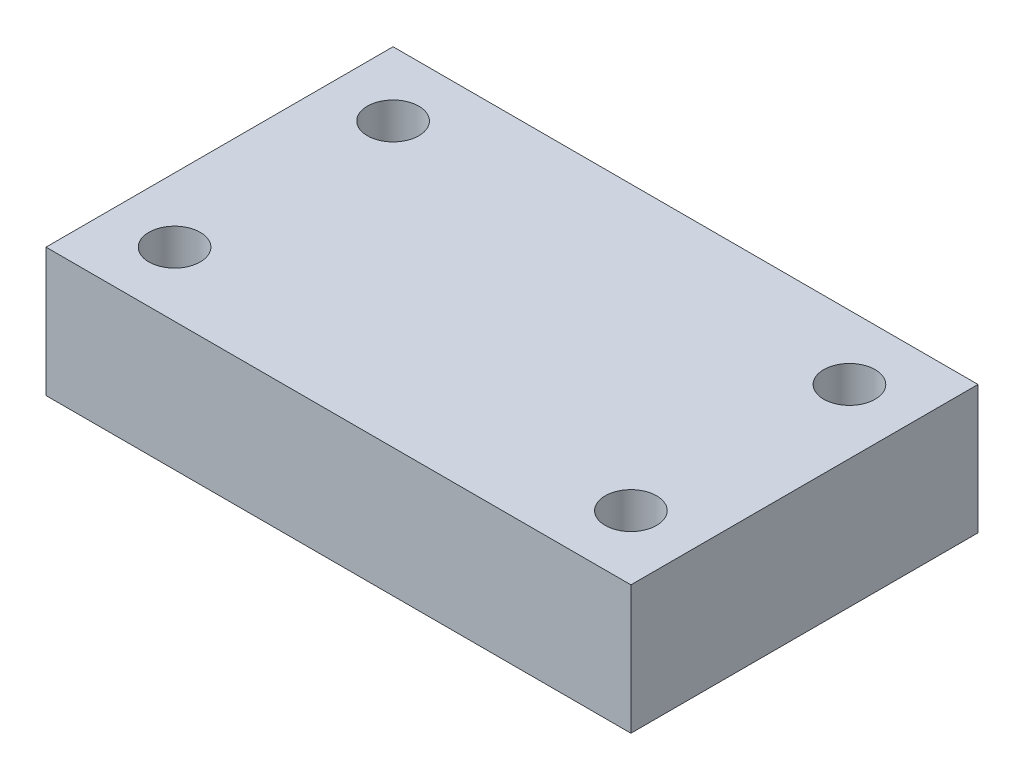
ISO-10303-21;
HEADER;
FILE_DESCRIPTION(('STEP AP214'),'2;1');
FILE_NAME('part.step','',(''),(''),'','','');
FILE_SCHEMA(('AUTOMOTIVE_DESIGN { 1 0 10303 214 1 1 1 1 }'));
ENDSEC;
DATA;
#1=APPLICATION_CONTEXT('core data for automotive mechanical design processes');
#2=APPLICATION_PROTOCOL_DEFINITION('international standard','automotive_design',2000,#1);
#3=PRODUCT_CONTEXT('',#1,'mechanical');
#4=PRODUCT('Part','Part','',(#3));
#5=PRODUCT_RELATED_PRODUCT_CATEGORY('part','',(#4));
#6=PRODUCT_DEFINITION_FORMATION('','',#4);
#7=PRODUCT_DEFINITION_CONTEXT('part definition',#1,'design');
#8=PRODUCT_DEFINITION('design','',#6,#7);
#9=PRODUCT_DEFINITION_SHAPE('','',#8);
#10=(LENGTH_UNIT() NAMED_UNIT(*) SI_UNIT(.MILLI.,.METRE.));
#11=(NAMED_UNIT(*) PLANE_ANGLE_UNIT() SI_UNIT($,.RADIAN.));
#12=(NAMED_UNIT(*) SI_UNIT($,.STERADIAN.) SOLID_ANGLE_UNIT());
#13=UNCERTAINTY_MEASURE_WITH_UNIT(LENGTH_MEASURE(1.E-05),#10,'distance_accuracy_value','');
#14=(GEOMETRIC_REPRESENTATION_CONTEXT(3) GLOBAL_UNCERTAINTY_ASSIGNED_CONTEXT((#13)) GLOBAL_UNIT_ASSIGNED_CONTEXT((#10,
#11,#12)) REPRESENTATION_CONTEXT('',''));
#15=CARTESIAN_POINT('',(0.,0.,0.));
#16=DIRECTION('',(0.,0.,1.));
#17=DIRECTION('',(1.,0.,0.));
#18=AXIS2_PLACEMENT_3D('',#15,#16,#17);
#19=CARTESIAN_POINT('',(-17.75,10.,8.5));
#20=DIRECTION('',(0.,-1.,0.));
#21=DIRECTION('',(0.,0.,-1.));
#22=AXIS2_PLACEMENT_3D('',#19,#20,#21);
#23=CYLINDRICAL_SURFACE('',#22,2.00000000000001);
#24=CARTESIAN_POINT('',(-17.75,10.,8.5));
#25=DIRECTION('',(0.,1.,0.));
#26=DIRECTION('',(0.,0.,1.));
#27=AXIS2_PLACEMENT_3D('',#24,#25,#26);
#28=CIRCLE('',#27,2.00000000000001);
#29=CARTESIAN_POINT('',(-17.75,10.,10.5));
#30=VERTEX_POINT('',#29);
#31=EDGE_CURVE('E186',#30,#30,#28,.T.);
#32=ORIENTED_EDGE('',*,*,#31,.T.);
#33=EDGE_LOOP('',(#32));
#34=FACE_BOUND('',#33,.T.);
#35=CARTESIAN_POINT('',(-17.75,6.,8.5));
#36=DIRECTION('',(0.,-1.,0.));
#37=DIRECTION('',(0.,0.,-1.));
#38=AXIS2_PLACEMENT_3D('',#35,#36,#37);
#39=CIRCLE('',#38,2.00000000000001);
#40=CARTESIAN_POINT('',(-17.75,6.,6.49999999999999));
#41=VERTEX_POINT('',#40);
#42=EDGE_CURVE('E109',#41,#41,#39,.T.);
#43=ORIENTED_EDGE('',*,*,#42,.T.);
#44=EDGE_LOOP('',(#43));
#45=FACE_BOUND('',#44,.T.);
#46=ADVANCED_FACE('F105',(#34,#45),#23,.F.);
#47=CARTESIAN_POINT('',(-17.75,10.,-8.5));
#48=DIRECTION('',(0.,-1.,0.));
#49=DIRECTION('',(0.,0.,-1.));
#50=AXIS2_PLACEMENT_3D('',#47,#48,#49);
#51=CYLINDRICAL_SURFACE('',#50,2.00000000000001);
#52=CARTESIAN_POINT('',(-17.75,10.,-8.5));
#53=DIRECTION('',(0.,1.,0.));
#54=DIRECTION('',(0.,0.,1.));
#55=AXIS2_PLACEMENT_3D('',#52,#53,#54);
#56=CIRCLE('',#55,2.00000000000001);
#57=CARTESIAN_POINT('',(-17.75,10.,-6.49999999999999));
#58=VERTEX_POINT('',#57);
#59=EDGE_CURVE('E223',#58,#58,#56,.T.);
#60=ORIENTED_EDGE('',*,*,#59,.T.);
#61=EDGE_LOOP('',(#60));
#62=FACE_BOUND('',#61,.T.);
#63=CARTESIAN_POINT('',(-17.75,6.,-8.5));
#64=DIRECTION('',(0.,-1.,0.));
#65=DIRECTION('',(0.,0.,-1.));
#66=AXIS2_PLACEMENT_3D('',#63,#64,#65);
#67=CIRCLE('',#66,2.00000000000001);
#68=CARTESIAN_POINT('',(-17.75,6.,-10.5));
#69=VERTEX_POINT('',#68);
#70=EDGE_CURVE('E205',#69,#69,#67,.T.);
#71=ORIENTED_EDGE('',*,*,#70,.T.);
#72=EDGE_LOOP('',(#71));
#73=FACE_BOUND('',#72,.T.);
#74=ADVANCED_FACE('F238',(#62,#73),#51,.F.);
#75=CARTESIAN_POINT('',(0.,10.,0.));
#76=DIRECTION('',(0.,-1.,0.));
#77=DIRECTION('',(0.,0.,-1.));
#78=AXIS2_PLACEMENT_3D('',#75,#76,#77);
#79=PLANE('',#78);
#80=DIRECTION('',(1.,0.,0.));
#81=VECTOR('',#80,1.);
#82=CARTESIAN_POINT('',(-22.75,10.,-13.5));
#83=LINE('',#82,#81);
#84=CARTESIAN_POINT('',(-22.75,10.,-13.5));
#85=VERTEX_POINT('',#84);
#86=CARTESIAN_POINT('',(22.75,10.,-13.5));
#87=VERTEX_POINT('',#86);
#88=EDGE_CURVE('E173',#85,#87,#83,.T.);
#89=ORIENTED_EDGE('',*,*,#88,.F.);
#90=DIRECTION('',(0.,0.,1.));
#91=VECTOR('',#90,1.);
#92=CARTESIAN_POINT('',(-22.75,10.,-13.5));
#93=LINE('',#92,#91);
#94=CARTESIAN_POINT('',(-22.75,10.,13.5));
#95=VERTEX_POINT('',#94);
#96=EDGE_CURVE('E159',#85,#95,#93,.T.);
#97=ORIENTED_EDGE('',*,*,#96,.T.);
#98=DIRECTION('',(1.,0.,0.));
#99=VECTOR('',#98,1.);
#100=CARTESIAN_POINT('',(-22.75,10.,13.5));
#101=LINE('',#100,#99);
#102=CARTESIAN_POINT('',(22.75,10.,13.5));
#103=VERTEX_POINT('',#102);
#104=EDGE_CURVE('E153',#95,#103,#101,.T.);
#105=ORIENTED_EDGE('',*,*,#104,.T.);
#106=DIRECTION('',(0.,0.,1.));
#107=VECTOR('',#106,1.);
#108=CARTESIAN_POINT('',(22.75,10.,-13.5));
#109=LINE('',#108,#107);
#110=EDGE_CURVE('E158',#87,#103,#109,.T.);
#111=ORIENTED_EDGE('',*,*,#110,.F.);
#112=EDGE_LOOP('',(#89,#97,#105,#111));
#113=FACE_BOUND('',#112,.T.);
#114=ORIENTED_EDGE('',*,*,#31,.F.);
#115=EDGE_LOOP('',(#114));
#116=FACE_BOUND('',#115,.T.);
#117=ORIENTED_EDGE('',*,*,#59,.F.);
#118=EDGE_LOOP('',(#117));
#119=FACE_BOUND('',#118,.T.);
#120=CARTESIAN_POINT('',(17.75,10.,8.5));
#121=DIRECTION('',(0.,1.,0.));
#122=DIRECTION('',(0.,0.,1.));
#123=AXIS2_PLACEMENT_3D('',#120,#121,#122);
#124=CIRCLE('',#123,2.);
#125=CARTESIAN_POINT('',(17.75,10.,10.5));
#126=VERTEX_POINT('',#125);
#127=EDGE_CURVE('E217',#126,#126,#124,.T.);
#128=ORIENTED_EDGE('',*,*,#127,.F.);
#129=EDGE_LOOP('',(#128));
#130=FACE_BOUND('',#129,.T.);
#131=CARTESIAN_POINT('',(17.75,10.,-8.5));
#132=DIRECTION('',(0.,1.,0.));
#133=DIRECTION('',(0.,0.,1.));
#134=AXIS2_PLACEMENT_3D('',#131,#132,#133);
#135=CIRCLE('',#134,2.);
#136=CARTESIAN_POINT('',(17.75,10.,-6.5));
#137=VERTEX_POINT('',#136);
#138=EDGE_CURVE('E212',#137,#137,#135,.T.);
#139=ORIENTED_EDGE('',*,*,#138,.F.);
#140=EDGE_LOOP('',(#139));
#141=FACE_BOUND('',#140,.T.);
#142=ADVANCED_FACE('F156',(#113,#116,#119,#130,#141),#79,.F.);
#143=CARTESIAN_POINT('',(0.,0.,0.));
#144=DIRECTION('',(0.,-1.,0.));
#145=DIRECTION('',(0.,0.,-1.));
#146=AXIS2_PLACEMENT_3D('',#143,#144,#145);
#147=PLANE('',#146);
#148=CARTESIAN_POINT('',(17.75,0.,8.49999999999999));
#149=DIRECTION('',(0.,-1.,0.));
#150=DIRECTION('',(0.,0.,1.));
#151=AXIS2_PLACEMENT_3D('',#148,#149,#150);
#152=CIRCLE('',#151,3.);
#153=CARTESIAN_POINT('',(17.75,0.,11.5));
#154=VERTEX_POINT('',#153);
#155=EDGE_CURVE('E397',#154,#154,#152,.T.);
#156=ORIENTED_EDGE('',*,*,#155,.F.);
#157=EDGE_LOOP('',(#156));
#158=FACE_BOUND('',#157,.T.);
#159=CARTESIAN_POINT('',(17.75,0.,-8.50000000000001));
#160=DIRECTION('',(0.,-1.,0.));
#161=DIRECTION('',(0.,0.,1.));
#162=AXIS2_PLACEMENT_3D('',#159,#160,#161);
#163=CIRCLE('',#162,3.);
#164=CARTESIAN_POINT('',(17.75,0.,-5.50000000000001));
#165=VERTEX_POINT('',#164);
#166=EDGE_CURVE('E405',#165,#165,#163,.T.);
#167=ORIENTED_EDGE('',*,*,#166,.F.);
#168=EDGE_LOOP('',(#167));
#169=FACE_BOUND('',#168,.T.);
#170=CARTESIAN_POINT('',(-17.75,0.,-8.5));
#171=DIRECTION('',(0.,-1.,0.));
#172=DIRECTION('',(0.,0.,-1.));
#173=AXIS2_PLACEMENT_3D('',#170,#171,#172);
#174=CIRCLE('',#173,3.);
#175=CARTESIAN_POINT('',(-17.75,0.,-11.5));
#176=VERTEX_POINT('',#175);
#177=EDGE_CURVE('E391',#176,#176,#174,.T.);
#178=ORIENTED_EDGE('',*,*,#177,.F.);
#179=EDGE_LOOP('',(#178));
#180=FACE_BOUND('',#179,.T.);
#181=CARTESIAN_POINT('',(-17.75,0.,8.5));
#182=DIRECTION('',(0.,-1.,0.));
#183=DIRECTION('',(0.,0.,-1.));
#184=AXIS2_PLACEMENT_3D('',#181,#182,#183);
#185=CIRCLE('',#184,3.);
#186=CARTESIAN_POINT('',(-17.75,0.,5.5));
#187=VERTEX_POINT('',#186);
#188=EDGE_CURVE('E226',#187,#187,#185,.T.);
#189=ORIENTED_EDGE('',*,*,#188,.F.);
#190=EDGE_LOOP('',(#189));
#191=FACE_BOUND('',#190,.T.);
#192=DIRECTION('',(1.,0.,0.));
#193=VECTOR('',#192,1.);
#194=CARTESIAN_POINT('',(-22.75,0.,-13.5));
#195=LINE('',#194,#193);
#196=CARTESIAN_POINT('',(-22.75,0.,-13.5));
#197=VERTEX_POINT('',#196);
#198=CARTESIAN_POINT('',(22.75,0.,-13.5));
#199=VERTEX_POINT('',#198);
#200=EDGE_CURVE('E181',#197,#199,#195,.T.);
#201=ORIENTED_EDGE('',*,*,#200,.T.);
#202=DIRECTION('',(0.,0.,1.));
#203=VECTOR('',#202,1.);
#204=CARTESIAN_POINT('',(22.75,0.,-13.5));
#205=LINE('',#204,#203);
#206=CARTESIAN_POINT('',(22.75,0.,13.5));
#207=VERTEX_POINT('',#206);
#208=EDGE_CURVE('E185',#199,#207,#205,.T.);
#209=ORIENTED_EDGE('',*,*,#208,.T.);
#210=DIRECTION('',(1.,0.,0.));
#211=VECTOR('',#210,1.);
#212=CARTESIAN_POINT('',(-22.75,0.,13.5));
#213=LINE('',#212,#211);
#214=CARTESIAN_POINT('',(-22.75,0.,13.5));
#215=VERTEX_POINT('',#214);
#216=EDGE_CURVE('E167',#215,#207,#213,.T.);
#217=ORIENTED_EDGE('',*,*,#216,.F.);
#218=DIRECTION('',(0.,0.,1.));
#219=VECTOR('',#218,1.);
#220=CARTESIAN_POINT('',(-22.75,0.,-13.5));
#221=LINE('',#220,#219);
#222=EDGE_CURVE('E140',#197,#215,#221,.T.);
#223=ORIENTED_EDGE('',*,*,#222,.F.);
#224=EDGE_LOOP('',(#201,#209,#217,#223));
#225=FACE_BOUND('',#224,.T.);
#226=ADVANCED_FACE('F237',(#158,#169,#180,#191,#225),#147,.T.);
#227=CARTESIAN_POINT('',(-22.75,10.,-13.5));
#228=DIRECTION('',(0.,0.,-1.));
#229=DIRECTION('',(-1.,0.,0.));
#230=AXIS2_PLACEMENT_3D('',#227,#228,#229);
#231=PLANE('',#230);
#232=ORIENTED_EDGE('',*,*,#200,.F.);
#233=DIRECTION('',(0.,-1.,0.));
#234=VECTOR('',#233,1.);
#235=CARTESIAN_POINT('',(-22.75,10.,-13.5));
#236=LINE('',#235,#234);
#237=EDGE_CURVE('E12',#85,#197,#236,.T.);
#238=ORIENTED_EDGE('',*,*,#237,.F.);
#239=ORIENTED_EDGE('',*,*,#88,.T.);
#240=DIRECTION('',(0.,-1.,0.));
#241=VECTOR('',#240,1.);
#242=CARTESIAN_POINT('',(22.75,10.,-13.5));
#243=LINE('',#242,#241);
#244=EDGE_CURVE('E148',#87,#199,#243,.T.);
#245=ORIENTED_EDGE('',*,*,#244,.T.);
#246=EDGE_LOOP('',(#232,#238,#239,#245));
#247=FACE_BOUND('',#246,.T.);
#248=ADVANCED_FACE('F107',(#247),#231,.T.);
#249=CARTESIAN_POINT('',(-22.75,10.,-13.5));
#250=DIRECTION('',(1.,0.,0.));
#251=DIRECTION('',(0.,0.,-1.));
#252=AXIS2_PLACEMENT_3D('',#249,#250,#251);
#253=PLANE('',#252);
#254=ORIENTED_EDGE('',*,*,#222,.T.);
#255=DIRECTION('',(0.,-1.,0.));
#256=VECTOR('',#255,1.);
#257=CARTESIAN_POINT('',(-22.75,10.,13.5));
#258=LINE('',#257,#256);
#259=EDGE_CURVE('E116',#95,#215,#258,.T.);
#260=ORIENTED_EDGE('',*,*,#259,.F.);
#261=ORIENTED_EDGE('',*,*,#96,.F.);
#262=ORIENTED_EDGE('',*,*,#237,.T.);
#263=EDGE_LOOP('',(#254,#260,#261,#262));
#264=FACE_BOUND('',#263,.T.);
#265=ADVANCED_FACE('F269',(#264),#253,.F.);
#266=CARTESIAN_POINT('',(-22.75,10.,13.5));
#267=DIRECTION('',(0.,0.,-1.));
#268=DIRECTION('',(-1.,0.,0.));
#269=AXIS2_PLACEMENT_3D('',#266,#267,#268);
#270=PLANE('',#269);
#271=ORIENTED_EDGE('',*,*,#216,.T.);
#272=DIRECTION('',(0.,-1.,0.));
#273=VECTOR('',#272,1.);
#274=CARTESIAN_POINT('',(22.75,10.,13.5));
#275=LINE('',#274,#273);
#276=EDGE_CURVE('E164',#103,#207,#275,.T.);
#277=ORIENTED_EDGE('',*,*,#276,.F.);
#278=ORIENTED_EDGE('',*,*,#104,.F.);
#279=ORIENTED_EDGE('',*,*,#259,.T.);
#280=EDGE_LOOP('',(#271,#277,#278,#279));
#281=FACE_BOUND('',#280,.T.);
#282=ADVANCED_FACE('F165',(#281),#270,.F.);
#283=CARTESIAN_POINT('',(22.75,10.,-13.5));
#284=DIRECTION('',(1.,0.,0.));
#285=DIRECTION('',(0.,0.,-1.));
#286=AXIS2_PLACEMENT_3D('',#283,#284,#285);
#287=PLANE('',#286);
#288=ORIENTED_EDGE('',*,*,#208,.F.);
#289=ORIENTED_EDGE('',*,*,#244,.F.);
#290=ORIENTED_EDGE('',*,*,#110,.T.);
#291=ORIENTED_EDGE('',*,*,#276,.T.);
#292=EDGE_LOOP('',(#288,#289,#290,#291));
#293=FACE_BOUND('',#292,.T.);
#294=ADVANCED_FACE('F171',(#293),#287,.T.);
#295=CARTESIAN_POINT('',(17.75,10.,8.5));
#296=DIRECTION('',(0.,-1.,0.));
#297=DIRECTION('',(0.,0.,-1.));
#298=AXIS2_PLACEMENT_3D('',#295,#296,#297);
#299=CYLINDRICAL_SURFACE('',#298,2.);
#300=CARTESIAN_POINT('',(17.75,6.,8.5));
#301=DIRECTION('',(0.,1.,0.));
#302=DIRECTION('',(0.,0.,1.));
#303=AXIS2_PLACEMENT_3D('',#300,#301,#302);
#304=CIRCLE('',#303,2.);
#305=CARTESIAN_POINT('',(17.75,6.,10.5));
#306=VERTEX_POINT('',#305);
#307=EDGE_CURVE('E201',#306,#306,#304,.T.);
#308=ORIENTED_EDGE('',*,*,#307,.F.);
#309=EDGE_LOOP('',(#308));
#310=FACE_BOUND('',#309,.T.);
#311=ORIENTED_EDGE('',*,*,#127,.T.);
#312=EDGE_LOOP('',(#311));
#313=FACE_BOUND('',#312,.T.);
#314=ADVANCED_FACE('F245',(#310,#313),#299,.F.);
#315=CARTESIAN_POINT('',(17.75,10.,-8.5));
#316=DIRECTION('',(0.,-1.,0.));
#317=DIRECTION('',(0.,0.,-1.));
#318=AXIS2_PLACEMENT_3D('',#315,#316,#317);
#319=CYLINDRICAL_SURFACE('',#318,2.);
#320=CARTESIAN_POINT('',(17.75,6.,-8.5));
#321=DIRECTION('',(0.,1.,0.));
#322=DIRECTION('',(0.,0.,1.));
#323=AXIS2_PLACEMENT_3D('',#320,#321,#322);
#324=CIRCLE('',#323,2.);
#325=CARTESIAN_POINT('',(17.75,6.,-6.5));
#326=VERTEX_POINT('',#325);
#327=EDGE_CURVE('E197',#326,#326,#324,.T.);
#328=ORIENTED_EDGE('',*,*,#327,.F.);
#329=EDGE_LOOP('',(#328));
#330=FACE_BOUND('',#329,.T.);
#331=ORIENTED_EDGE('',*,*,#138,.T.);
#332=EDGE_LOOP('',(#331));
#333=FACE_BOUND('',#332,.T.);
#334=ADVANCED_FACE('F247',(#330,#333),#319,.F.);
#335=CARTESIAN_POINT('',(17.75,6.,-8.50000000000001));
#336=DIRECTION('',(0.,-1.,0.));
#337=DIRECTION('',(0.,0.,-1.));
#338=AXIS2_PLACEMENT_3D('',#335,#336,#337);
#339=CYLINDRICAL_SURFACE('',#338,3.);
#340=CARTESIAN_POINT('',(17.75,6.,-8.50000000000001));
#341=DIRECTION('',(0.,-1.,0.));
#342=DIRECTION('',(0.,0.,1.));
#343=AXIS2_PLACEMENT_3D('',#340,#341,#342);
#344=CIRCLE('',#343,3.);
#345=CARTESIAN_POINT('',(17.75,6.,-5.50000000000001));
#346=VERTEX_POINT('',#345);
#347=EDGE_CURVE('E401',#346,#346,#344,.T.);
#348=ORIENTED_EDGE('',*,*,#347,.F.);
#349=EDGE_LOOP('',(#348));
#350=FACE_BOUND('',#349,.T.);
#351=ORIENTED_EDGE('',*,*,#166,.T.);
#352=EDGE_LOOP('',(#351));
#353=FACE_BOUND('',#352,.T.);
#354=ADVANCED_FACE('F254',(#350,#353),#339,.F.);
#355=CARTESIAN_POINT('',(17.75,6.,-8.50000000000001));
#356=DIRECTION('',(0.,1.,0.));
#357=DIRECTION('',(0.,0.,1.));
#358=AXIS2_PLACEMENT_3D('',#355,#356,#357);
#359=PLANE('',#358);
#360=ORIENTED_EDGE('',*,*,#327,.T.);
#361=EDGE_LOOP('',(#360));
#362=FACE_BOUND('',#361,.T.);
#363=ORIENTED_EDGE('',*,*,#347,.T.);
#364=EDGE_LOOP('',(#363));
#365=FACE_BOUND('',#364,.T.);
#366=ADVANCED_FACE('F312',(#362,#365),#359,.F.);
#367=CARTESIAN_POINT('',(17.75,6.,8.49999999999999));
#368=DIRECTION('',(0.,-1.,0.));
#369=DIRECTION('',(0.,0.,-1.));
#370=AXIS2_PLACEMENT_3D('',#367,#368,#369);
#371=CYLINDRICAL_SURFACE('',#370,3.);
#372=CARTESIAN_POINT('',(17.75,6.,8.49999999999999));
#373=DIRECTION('',(0.,-1.,0.));
#374=DIRECTION('',(0.,0.,1.));
#375=AXIS2_PLACEMENT_3D('',#372,#373,#374);
#376=CIRCLE('',#375,3.);
#377=CARTESIAN_POINT('',(17.75,6.,11.5));
#378=VERTEX_POINT('',#377);
#379=EDGE_CURVE('E393',#378,#378,#376,.T.);
#380=ORIENTED_EDGE('',*,*,#379,.F.);
#381=EDGE_LOOP('',(#380));
#382=FACE_BOUND('',#381,.T.);
#383=ORIENTED_EDGE('',*,*,#155,.T.);
#384=EDGE_LOOP('',(#383));
#385=FACE_BOUND('',#384,.T.);
#386=ADVANCED_FACE('F322',(#382,#385),#371,.F.);
#387=CARTESIAN_POINT('',(17.75,6.,8.49999999999999));
#388=DIRECTION('',(0.,1.,0.));
#389=DIRECTION('',(0.,0.,1.));
#390=AXIS2_PLACEMENT_3D('',#387,#388,#389);
#391=PLANE('',#390);
#392=ORIENTED_EDGE('',*,*,#307,.T.);
#393=EDGE_LOOP('',(#392));
#394=FACE_BOUND('',#393,.T.);
#395=ORIENTED_EDGE('',*,*,#379,.T.);
#396=EDGE_LOOP('',(#395));
#397=FACE_BOUND('',#396,.T.);
#398=ADVANCED_FACE('F332',(#394,#397),#391,.F.);
#399=CARTESIAN_POINT('',(-17.75,6.,-8.5));
#400=DIRECTION('',(0.,-1.,0.));
#401=DIRECTION('',(0.,0.,-1.));
#402=AXIS2_PLACEMENT_3D('',#399,#400,#401);
#403=CYLINDRICAL_SURFACE('',#402,3.);
#404=CARTESIAN_POINT('',(-17.75,6.,-8.5));
#405=DIRECTION('',(0.,-1.,0.));
#406=DIRECTION('',(0.,0.,-1.));
#407=AXIS2_PLACEMENT_3D('',#404,#405,#406);
#408=CIRCLE('',#407,3.);
#409=CARTESIAN_POINT('',(-17.75,6.,-11.5));
#410=VERTEX_POINT('',#409);
#411=EDGE_CURVE('E409',#410,#410,#408,.T.);
#412=ORIENTED_EDGE('',*,*,#411,.F.);
#413=EDGE_LOOP('',(#412));
#414=FACE_BOUND('',#413,.T.);
#415=ORIENTED_EDGE('',*,*,#177,.T.);
#416=EDGE_LOOP('',(#415));
#417=FACE_BOUND('',#416,.T.);
#418=ADVANCED_FACE('F342',(#414,#417),#403,.F.);
#419=CARTESIAN_POINT('',(-17.75,6.,-8.5));
#420=DIRECTION('',(0.,-1.,0.));
#421=DIRECTION('',(0.,0.,-1.));
#422=AXIS2_PLACEMENT_3D('',#419,#420,#421);
#423=PLANE('',#422);
#424=ORIENTED_EDGE('',*,*,#70,.F.);
#425=EDGE_LOOP('',(#424));
#426=FACE_BOUND('',#425,.T.);
#427=ORIENTED_EDGE('',*,*,#411,.T.);
#428=EDGE_LOOP('',(#427));
#429=FACE_BOUND('',#428,.T.);
#430=ADVANCED_FACE('F352',(#426,#429),#423,.T.);
#431=CARTESIAN_POINT('',(-17.75,6.,8.5));
#432=DIRECTION('',(0.,-1.,0.));
#433=DIRECTION('',(0.,0.,-1.));
#434=AXIS2_PLACEMENT_3D('',#431,#432,#433);
#435=CYLINDRICAL_SURFACE('',#434,3.);
#436=CARTESIAN_POINT('',(-17.75,6.,8.5));
#437=DIRECTION('',(0.,-1.,0.));
#438=DIRECTION('',(0.,0.,-1.));
#439=AXIS2_PLACEMENT_3D('',#436,#437,#438);
#440=CIRCLE('',#439,3.);
#441=CARTESIAN_POINT('',(-17.75,6.,5.5));
#442=VERTEX_POINT('',#441);
#443=EDGE_CURVE('E202',#442,#442,#440,.T.);
#444=ORIENTED_EDGE('',*,*,#443,.F.);
#445=EDGE_LOOP('',(#444));
#446=FACE_BOUND('',#445,.T.);
#447=ORIENTED_EDGE('',*,*,#188,.T.);
#448=EDGE_LOOP('',(#447));
#449=FACE_BOUND('',#448,.T.);
#450=ADVANCED_FACE('F362',(#446,#449),#435,.F.);
#451=CARTESIAN_POINT('',(-17.75,6.,8.5));
#452=DIRECTION('',(0.,-1.,0.));
#453=DIRECTION('',(0.,0.,-1.));
#454=AXIS2_PLACEMENT_3D('',#451,#452,#453);
#455=PLANE('',#454);
#456=ORIENTED_EDGE('',*,*,#42,.F.);
#457=EDGE_LOOP('',(#456));
#458=FACE_BOUND('',#457,.T.);
#459=ORIENTED_EDGE('',*,*,#443,.T.);
#460=EDGE_LOOP('',(#459));
#461=FACE_BOUND('',#460,.T.);
#462=ADVANCED_FACE('F372',(#458,#461),#455,.T.);
#463=CLOSED_SHELL('',(#46,#74,#142,#226,#248,#265,#282,#294,#314,#334,#354,#366,#386,#398,#418,
#430,#450,#462));
#464=MANIFOLD_SOLID_BREP('B2',#463);
#465=ADVANCED_BREP_SHAPE_REPRESENTATION('',(#18,#464),#14);
#466=SHAPE_DEFINITION_REPRESENTATION(#9,#465);
ENDSEC;
END-ISO-10303-21;
